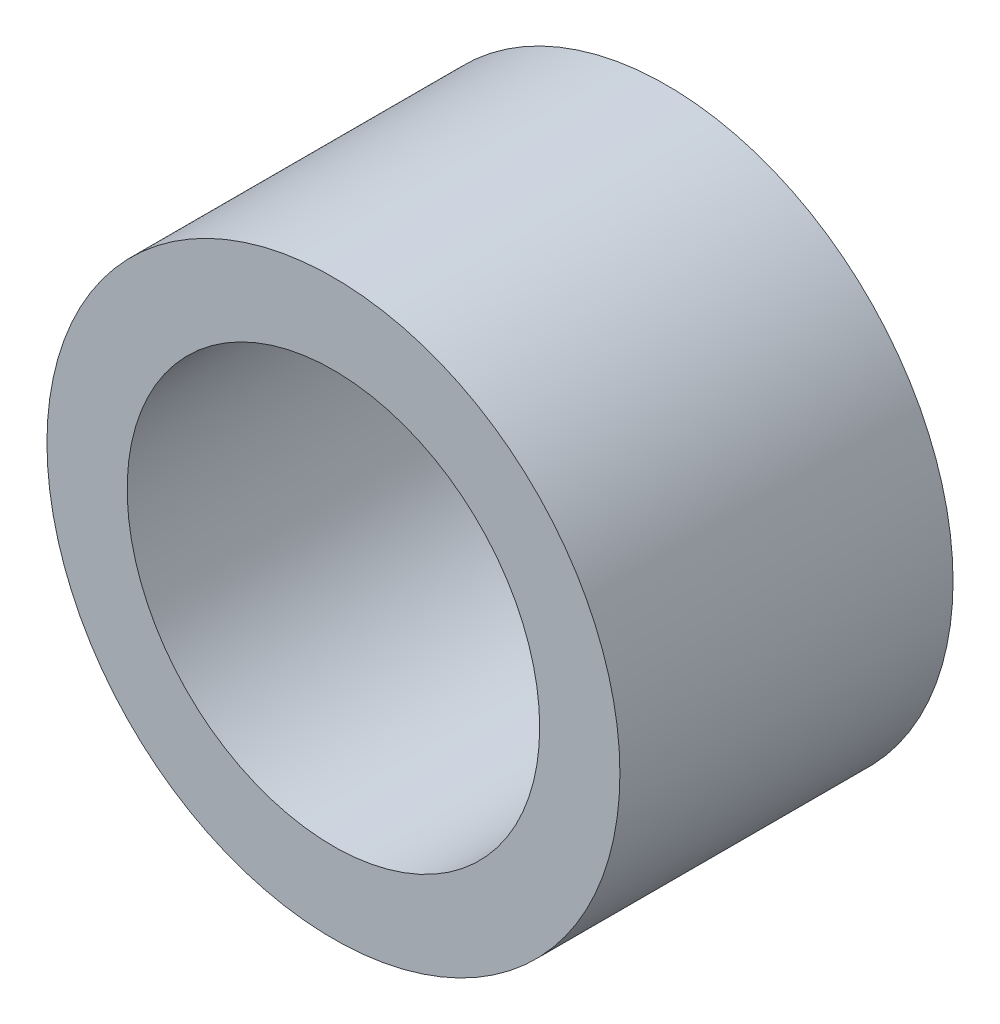
ISO-10303-21;
HEADER;
FILE_DESCRIPTION(('STEP AP214'),'2;1');
FILE_NAME('part.step','',(''),(''),'','','');
FILE_SCHEMA(('AUTOMOTIVE_DESIGN { 1 0 10303 214 1 1 1 1 }'));
ENDSEC;
DATA;
#1=APPLICATION_CONTEXT('core data for automotive mechanical design processes');
#2=APPLICATION_PROTOCOL_DEFINITION('international standard','automotive_design',2000,#1);
#3=PRODUCT_CONTEXT('',#1,'mechanical');
#4=PRODUCT('Part','Part','',(#3));
#5=PRODUCT_RELATED_PRODUCT_CATEGORY('part','',(#4));
#6=PRODUCT_DEFINITION_FORMATION('','',#4);
#7=PRODUCT_DEFINITION_CONTEXT('part definition',#1,'design');
#8=PRODUCT_DEFINITION('design','',#6,#7);
#9=PRODUCT_DEFINITION_SHAPE('','',#8);
#10=(LENGTH_UNIT() NAMED_UNIT(*) SI_UNIT(.MILLI.,.METRE.));
#11=(NAMED_UNIT(*) PLANE_ANGLE_UNIT() SI_UNIT($,.RADIAN.));
#12=(NAMED_UNIT(*) SI_UNIT($,.STERADIAN.) SOLID_ANGLE_UNIT());
#13=UNCERTAINTY_MEASURE_WITH_UNIT(LENGTH_MEASURE(1.E-05),#10,'distance_accuracy_value','');
#14=(GEOMETRIC_REPRESENTATION_CONTEXT(3) GLOBAL_UNCERTAINTY_ASSIGNED_CONTEXT((#13)) GLOBAL_UNIT_ASSIGNED_CONTEXT((#10,
#11,#12)) REPRESENTATION_CONTEXT('',''));
#15=CARTESIAN_POINT('',(0.,0.,0.));
#16=DIRECTION('',(0.,0.,1.));
#17=DIRECTION('',(1.,0.,0.));
#18=AXIS2_PLACEMENT_3D('',#15,#16,#17);
#19=CARTESIAN_POINT('',(0.,3.2004,0.));
#20=DIRECTION('',(0.,0.,-1.));
#21=DIRECTION('',(-1.,0.,0.));
#22=AXIS2_PLACEMENT_3D('',#19,#20,#21);
#23=PLANE('',#22);
#24=CARTESIAN_POINT('',(0.,0.,0.));
#25=DIRECTION('',(0.,0.,1.));
#26=DIRECTION('',(1.,0.,0.));
#27=AXIS2_PLACEMENT_3D('',#24,#25,#26);
#28=CIRCLE('',#27,3.2004);
#29=CARTESIAN_POINT('',(3.2004,0.,0.));
#30=VERTEX_POINT('',#29);
#31=EDGE_CURVE('E47',#30,#30,#28,.T.);
#32=ORIENTED_EDGE('',*,*,#31,.F.);
#33=EDGE_LOOP('',(#32));
#34=FACE_BOUND('',#33,.T.);
#35=CARTESIAN_POINT('',(0.,0.,0.));
#36=DIRECTION('',(0.,0.,1.));
#37=DIRECTION('',(1.,0.,0.));
#38=AXIS2_PLACEMENT_3D('',#35,#36,#37);
#39=CIRCLE('',#38,4.445);
#40=CARTESIAN_POINT('',(4.445,0.,0.));
#41=VERTEX_POINT('',#40);
#42=EDGE_CURVE('E10',#41,#41,#39,.T.);
#43=ORIENTED_EDGE('',*,*,#42,.T.);
#44=EDGE_LOOP('',(#43));
#45=FACE_BOUND('',#44,.T.);
#46=ADVANCED_FACE('F33',(#34,#45),#23,.F.);
#47=CARTESIAN_POINT('',(0.,0.,0.));
#48=DIRECTION('',(0.,0.,1.));
#49=DIRECTION('',(1.,0.,0.));
#50=AXIS2_PLACEMENT_3D('',#47,#48,#49);
#51=CYLINDRICAL_SURFACE('',#50,4.445);
#52=ORIENTED_EDGE('',*,*,#42,.F.);
#53=EDGE_LOOP('',(#52));
#54=FACE_BOUND('',#53,.T.);
#55=CARTESIAN_POINT('',(0.,0.,-5.1689));
#56=DIRECTION('',(0.,0.,1.));
#57=DIRECTION('',(1.,0.,0.));
#58=AXIS2_PLACEMENT_3D('',#55,#56,#57);
#59=CIRCLE('',#58,4.445);
#60=CARTESIAN_POINT('',(4.445,0.,-5.1689));
#61=VERTEX_POINT('',#60);
#62=EDGE_CURVE('E39',#61,#61,#59,.T.);
#63=ORIENTED_EDGE('',*,*,#62,.T.);
#64=EDGE_LOOP('',(#63));
#65=FACE_BOUND('',#64,.T.);
#66=ADVANCED_FACE('F56',(#54,#65),#51,.T.);
#67=CARTESIAN_POINT('',(0.,3.2004,-5.1689));
#68=DIRECTION('',(0.,0.,1.));
#69=DIRECTION('',(1.,0.,0.));
#70=AXIS2_PLACEMENT_3D('',#67,#68,#69);
#71=PLANE('',#70);
#72=ORIENTED_EDGE('',*,*,#62,.F.);
#73=EDGE_LOOP('',(#72));
#74=FACE_BOUND('',#73,.T.);
#75=CARTESIAN_POINT('',(0.,0.,-5.1689));
#76=DIRECTION('',(0.,0.,1.));
#77=DIRECTION('',(1.,0.,0.));
#78=AXIS2_PLACEMENT_3D('',#75,#76,#77);
#79=CIRCLE('',#78,3.2004);
#80=CARTESIAN_POINT('',(3.2004,0.,-5.1689));
#81=VERTEX_POINT('',#80);
#82=EDGE_CURVE('E43',#81,#81,#79,.T.);
#83=ORIENTED_EDGE('',*,*,#82,.T.);
#84=EDGE_LOOP('',(#83));
#85=FACE_BOUND('',#84,.T.);
#86=ADVANCED_FACE('F60',(#74,#85),#71,.F.);
#87=CARTESIAN_POINT('',(0.,0.,0.));
#88=DIRECTION('',(0.,0.,1.));
#89=DIRECTION('',(1.,0.,0.));
#90=AXIS2_PLACEMENT_3D('',#87,#88,#89);
#91=CYLINDRICAL_SURFACE('',#90,3.2004);
#92=ORIENTED_EDGE('',*,*,#82,.F.);
#93=EDGE_LOOP('',(#92));
#94=FACE_BOUND('',#93,.T.);
#95=ORIENTED_EDGE('',*,*,#31,.T.);
#96=EDGE_LOOP('',(#95));
#97=FACE_BOUND('',#96,.T.);
#98=ADVANCED_FACE('F53',(#94,#97),#91,.F.);
#99=CLOSED_SHELL('',(#46,#66,#86,#98));
#100=MANIFOLD_SOLID_BREP('B2',#99);
#101=ADVANCED_BREP_SHAPE_REPRESENTATION('',(#18,#100),#14);
#102=SHAPE_DEFINITION_REPRESENTATION(#9,#101);
ENDSEC;
END-ISO-10303-21;
